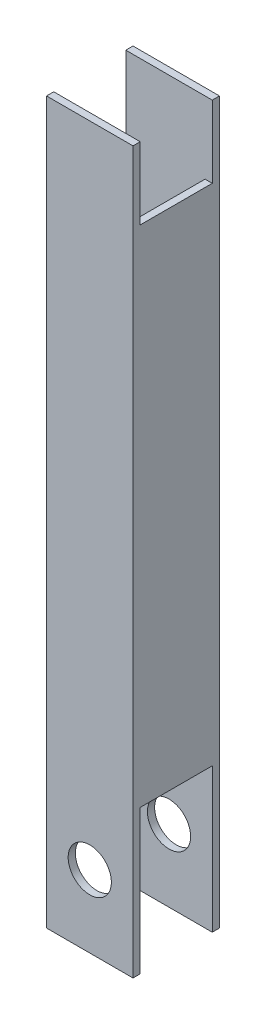
ISO-10303-21;
HEADER;
FILE_DESCRIPTION(('STEP AP214'),'2;1');
FILE_NAME('part.step','',(''),(''),'','','');
FILE_SCHEMA(('AUTOMOTIVE_DESIGN { 1 0 10303 214 1 1 1 1 }'));
ENDSEC;
DATA;
#1=APPLICATION_CONTEXT('core data for automotive mechanical design processes');
#2=APPLICATION_PROTOCOL_DEFINITION('international standard','automotive_design',2000,#1);
#3=PRODUCT_CONTEXT('',#1,'mechanical');
#4=PRODUCT('Part','Part','',(#3));
#5=PRODUCT_RELATED_PRODUCT_CATEGORY('part','',(#4));
#6=PRODUCT_DEFINITION_FORMATION('','',#4);
#7=PRODUCT_DEFINITION_CONTEXT('part definition',#1,'design');
#8=PRODUCT_DEFINITION('design','',#6,#7);
#9=PRODUCT_DEFINITION_SHAPE('','',#8);
#10=(LENGTH_UNIT() NAMED_UNIT(*) SI_UNIT(.MILLI.,.METRE.));
#11=(NAMED_UNIT(*) PLANE_ANGLE_UNIT() SI_UNIT($,.RADIAN.));
#12=(NAMED_UNIT(*) SI_UNIT($,.STERADIAN.) SOLID_ANGLE_UNIT());
#13=UNCERTAINTY_MEASURE_WITH_UNIT(LENGTH_MEASURE(1.E-05),#10,'distance_accuracy_value','');
#14=(GEOMETRIC_REPRESENTATION_CONTEXT(3) GLOBAL_UNCERTAINTY_ASSIGNED_CONTEXT((#13)) GLOBAL_UNIT_ASSIGNED_CONTEXT((#10,
#11,#12)) REPRESENTATION_CONTEXT('',''));
#15=CARTESIAN_POINT('',(0.,0.,0.));
#16=DIRECTION('',(0.,0.,1.));
#17=DIRECTION('',(1.,0.,0.));
#18=AXIS2_PLACEMENT_3D('',#15,#16,#17);
#19=CARTESIAN_POINT('',(0.,500.,0.));
#20=DIRECTION('',(0.,1.,0.));
#21=DIRECTION('',(0.,0.,1.));
#22=AXIS2_PLACEMENT_3D('',#19,#20,#21);
#23=PLANE('',#22);
#24=DIRECTION('',(1.,0.,0.));
#25=VECTOR('',#24,1.);
#26=CARTESIAN_POINT('',(30.,500.,25.));
#27=LINE('',#26,#25);
#28=CARTESIAN_POINT('',(-30.,500.,25.));
#29=VERTEX_POINT('',#28);
#30=CARTESIAN_POINT('',(30.,500.,25.));
#31=VERTEX_POINT('',#30);
#32=EDGE_CURVE('E170',#29,#31,#27,.T.);
#33=ORIENTED_EDGE('',*,*,#32,.F.);
#34=DIRECTION('',(0.,0.,1.));
#35=VECTOR('',#34,1.);
#36=CARTESIAN_POINT('',(-30.,500.,30.));
#37=LINE('',#36,#35);
#38=CARTESIAN_POINT('',(-30.,500.,30.));
#39=VERTEX_POINT('',#38);
#40=EDGE_CURVE('E201',#29,#39,#37,.T.);
#41=ORIENTED_EDGE('',*,*,#40,.T.);
#42=DIRECTION('',(1.,0.,0.));
#43=VECTOR('',#42,1.);
#44=CARTESIAN_POINT('',(30.,500.,30.));
#45=LINE('',#44,#43);
#46=CARTESIAN_POINT('',(30.,500.,30.));
#47=VERTEX_POINT('',#46);
#48=EDGE_CURVE('E288',#39,#47,#45,.T.);
#49=ORIENTED_EDGE('',*,*,#48,.T.);
#50=DIRECTION('',(0.,0.,-1.));
#51=VECTOR('',#50,1.);
#52=CARTESIAN_POINT('',(30.,500.,30.));
#53=LINE('',#52,#51);
#54=EDGE_CURVE('E215',#47,#31,#53,.T.);
#55=ORIENTED_EDGE('',*,*,#54,.T.);
#56=EDGE_LOOP('',(#33,#41,#49,#55));
#57=FACE_BOUND('',#56,.T.);
#58=ADVANCED_FACE('F47',(#57),#23,.T.);
#59=CARTESIAN_POINT('',(0.,0.,0.));
#60=DIRECTION('',(0.,1.,0.));
#61=DIRECTION('',(0.,0.,1.));
#62=AXIS2_PLACEMENT_3D('',#59,#60,#61);
#63=PLANE('',#62);
#64=DIRECTION('',(0.,0.,1.));
#65=VECTOR('',#64,1.);
#66=CARTESIAN_POINT('',(-30.,0.,30.));
#67=LINE('',#66,#65);
#68=CARTESIAN_POINT('',(-30.,0.,25.));
#69=VERTEX_POINT('',#68);
#70=CARTESIAN_POINT('',(-30.,0.,30.));
#71=VERTEX_POINT('',#70);
#72=EDGE_CURVE('E188',#69,#71,#67,.T.);
#73=ORIENTED_EDGE('',*,*,#72,.F.);
#74=DIRECTION('',(1.,0.,0.));
#75=VECTOR('',#74,1.);
#76=CARTESIAN_POINT('',(30.,0.,25.));
#77=LINE('',#76,#75);
#78=CARTESIAN_POINT('',(30.,0.,25.));
#79=VERTEX_POINT('',#78);
#80=EDGE_CURVE('E171',#69,#79,#77,.T.);
#81=ORIENTED_EDGE('',*,*,#80,.T.);
#82=DIRECTION('',(0.,0.,-1.));
#83=VECTOR('',#82,1.);
#84=CARTESIAN_POINT('',(30.,0.,30.));
#85=LINE('',#84,#83);
#86=CARTESIAN_POINT('',(30.,0.,30.));
#87=VERTEX_POINT('',#86);
#88=EDGE_CURVE('E196',#87,#79,#85,.T.);
#89=ORIENTED_EDGE('',*,*,#88,.F.);
#90=DIRECTION('',(1.,0.,0.));
#91=VECTOR('',#90,1.);
#92=CARTESIAN_POINT('',(30.,0.,30.));
#93=LINE('',#92,#91);
#94=EDGE_CURVE('E187',#71,#87,#93,.T.);
#95=ORIENTED_EDGE('',*,*,#94,.F.);
#96=EDGE_LOOP('',(#73,#81,#89,#95));
#97=FACE_BOUND('',#96,.T.);
#98=ADVANCED_FACE('F221',(#97),#63,.F.);
#99=CARTESIAN_POINT('',(-30.,500.,30.));
#100=DIRECTION('',(1.,0.,0.));
#101=DIRECTION('',(0.,0.,-1.));
#102=AXIS2_PLACEMENT_3D('',#99,#100,#101);
#103=PLANE('',#102);
#104=DIRECTION('',(0.,0.,1.));
#105=VECTOR('',#104,1.);
#106=CARTESIAN_POINT('',(-30.,100.,25.));
#107=LINE('',#106,#105);
#108=CARTESIAN_POINT('',(-30.,100.,-25.));
#109=VERTEX_POINT('',#108);
#110=CARTESIAN_POINT('',(-30.,100.,25.));
#111=VERTEX_POINT('',#110);
#112=EDGE_CURVE('E180',#109,#111,#107,.T.);
#113=ORIENTED_EDGE('',*,*,#112,.T.);
#114=DIRECTION('',(0.,-1.,0.));
#115=VECTOR('',#114,1.);
#116=CARTESIAN_POINT('',(-30.,0.,25.));
#117=LINE('',#116,#115);
#118=EDGE_CURVE('E311',#111,#69,#117,.T.);
#119=ORIENTED_EDGE('',*,*,#118,.T.);
#120=ORIENTED_EDGE('',*,*,#72,.T.);
#121=DIRECTION('',(0.,-1.,0.));
#122=VECTOR('',#121,1.);
#123=CARTESIAN_POINT('',(-30.,500.,30.));
#124=LINE('',#123,#122);
#125=EDGE_CURVE('E11',#39,#71,#124,.T.);
#126=ORIENTED_EDGE('',*,*,#125,.F.);
#127=ORIENTED_EDGE('',*,*,#40,.F.);
#128=DIRECTION('',(0.,-1.,0.));
#129=VECTOR('',#128,1.);
#130=CARTESIAN_POINT('',(-30.,450.,25.));
#131=LINE('',#130,#129);
#132=CARTESIAN_POINT('',(-30.,450.,25.));
#133=VERTEX_POINT('',#132);
#134=EDGE_CURVE('E245',#29,#133,#131,.T.);
#135=ORIENTED_EDGE('',*,*,#134,.T.);
#136=DIRECTION('',(0.,0.,-1.));
#137=VECTOR('',#136,1.);
#138=CARTESIAN_POINT('',(-30.,450.,25.));
#139=LINE('',#138,#137);
#140=CARTESIAN_POINT('',(-30.,450.,-25.));
#141=VERTEX_POINT('',#140);
#142=EDGE_CURVE('E254',#133,#141,#139,.T.);
#143=ORIENTED_EDGE('',*,*,#142,.T.);
#144=DIRECTION('',(0.,1.,0.));
#145=VECTOR('',#144,1.);
#146=CARTESIAN_POINT('',(-30.,450.,-25.));
#147=LINE('',#146,#145);
#148=CARTESIAN_POINT('',(-30.,500.,-25.));
#149=VERTEX_POINT('',#148);
#150=EDGE_CURVE('E262',#141,#149,#147,.T.);
#151=ORIENTED_EDGE('',*,*,#150,.T.);
#152=CARTESIAN_POINT('',(-30.,500.,-30.));
#153=VERTEX_POINT('',#152);
#154=EDGE_CURVE('E285',#153,#149,#37,.T.);
#155=ORIENTED_EDGE('',*,*,#154,.F.);
#156=DIRECTION('',(0.,-1.,0.));
#157=VECTOR('',#156,1.);
#158=CARTESIAN_POINT('',(-30.,500.,-30.));
#159=LINE('',#158,#157);
#160=CARTESIAN_POINT('',(-30.,0.,-30.));
#161=VERTEX_POINT('',#160);
#162=EDGE_CURVE('E186',#153,#161,#159,.T.);
#163=ORIENTED_EDGE('',*,*,#162,.T.);
#164=CARTESIAN_POINT('',(-30.,0.,-25.));
#165=VERTEX_POINT('',#164);
#166=EDGE_CURVE('E167',#161,#165,#67,.T.);
#167=ORIENTED_EDGE('',*,*,#166,.T.);
#168=DIRECTION('',(0.,1.,0.));
#169=VECTOR('',#168,1.);
#170=CARTESIAN_POINT('',(-30.,0.,-25.));
#171=LINE('',#170,#169);
#172=EDGE_CURVE('E174',#165,#109,#171,.T.);
#173=ORIENTED_EDGE('',*,*,#172,.T.);
#174=EDGE_LOOP('',(#113,#119,#120,#126,#127,#135,#143,#151,#155,#163,#167,#173));
#175=FACE_BOUND('',#174,.T.);
#176=ADVANCED_FACE('F49',(#175),#103,.F.);
#177=CARTESIAN_POINT('',(30.,500.,30.));
#178=DIRECTION('',(0.,0.,-1.));
#179=DIRECTION('',(-1.,0.,0.));
#180=AXIS2_PLACEMENT_3D('',#177,#178,#179);
#181=PLANE('',#180);
#182=CARTESIAN_POINT('',(0.,50.,30.));
#183=DIRECTION('',(0.,0.,-1.));
#184=DIRECTION('',(-1.,0.,0.));
#185=AXIS2_PLACEMENT_3D('',#182,#183,#184);
#186=CIRCLE('',#185,15.);
#187=CARTESIAN_POINT('',(-15.,50.,30.));
#188=VERTEX_POINT('',#187);
#189=EDGE_CURVE('E353',#188,#188,#186,.T.);
#190=ORIENTED_EDGE('',*,*,#189,.T.);
#191=EDGE_LOOP('',(#190));
#192=FACE_BOUND('',#191,.T.);
#193=ORIENTED_EDGE('',*,*,#94,.T.);
#194=DIRECTION('',(0.,-1.,0.));
#195=VECTOR('',#194,1.);
#196=CARTESIAN_POINT('',(30.,500.,30.));
#197=LINE('',#196,#195);
#198=EDGE_CURVE('E56',#47,#87,#197,.T.);
#199=ORIENTED_EDGE('',*,*,#198,.F.);
#200=ORIENTED_EDGE('',*,*,#48,.F.);
#201=ORIENTED_EDGE('',*,*,#125,.T.);
#202=EDGE_LOOP('',(#193,#199,#200,#201));
#203=FACE_BOUND('',#202,.T.);
#204=ADVANCED_FACE('F310',(#192,#203),#181,.F.);
#205=CARTESIAN_POINT('',(30.,500.,30.));
#206=DIRECTION('',(-1.,0.,0.));
#207=DIRECTION('',(0.,0.,1.));
#208=AXIS2_PLACEMENT_3D('',#205,#206,#207);
#209=PLANE('',#208);
#210=ORIENTED_EDGE('',*,*,#88,.T.);
#211=DIRECTION('',(0.,-1.,0.));
#212=VECTOR('',#211,1.);
#213=CARTESIAN_POINT('',(30.,0.,25.));
#214=LINE('',#213,#212);
#215=CARTESIAN_POINT('',(30.,100.,25.));
#216=VERTEX_POINT('',#215);
#217=EDGE_CURVE('E181',#216,#79,#214,.T.);
#218=ORIENTED_EDGE('',*,*,#217,.F.);
#219=DIRECTION('',(0.,0.,1.));
#220=VECTOR('',#219,1.);
#221=CARTESIAN_POINT('',(30.,100.,25.));
#222=LINE('',#221,#220);
#223=CARTESIAN_POINT('',(30.,100.,-25.));
#224=VERTEX_POINT('',#223);
#225=EDGE_CURVE('E233',#224,#216,#222,.T.);
#226=ORIENTED_EDGE('',*,*,#225,.F.);
#227=DIRECTION('',(0.,1.,0.));
#228=VECTOR('',#227,1.);
#229=CARTESIAN_POINT('',(30.,0.,-25.));
#230=LINE('',#229,#228);
#231=CARTESIAN_POINT('',(30.,0.,-25.));
#232=VERTEX_POINT('',#231);
#233=EDGE_CURVE('E235',#232,#224,#230,.T.);
#234=ORIENTED_EDGE('',*,*,#233,.F.);
#235=CARTESIAN_POINT('',(30.,0.,-30.));
#236=VERTEX_POINT('',#235);
#237=EDGE_CURVE('E168',#232,#236,#85,.T.);
#238=ORIENTED_EDGE('',*,*,#237,.T.);
#239=DIRECTION('',(0.,-1.,0.));
#240=VECTOR('',#239,1.);
#241=CARTESIAN_POINT('',(30.,500.,-30.));
#242=LINE('',#241,#240);
#243=CARTESIAN_POINT('',(30.,500.,-30.));
#244=VERTEX_POINT('',#243);
#245=EDGE_CURVE('E203',#244,#236,#242,.T.);
#246=ORIENTED_EDGE('',*,*,#245,.F.);
#247=CARTESIAN_POINT('',(30.,500.,-25.));
#248=VERTEX_POINT('',#247);
#249=EDGE_CURVE('E289',#248,#244,#53,.T.);
#250=ORIENTED_EDGE('',*,*,#249,.F.);
#251=DIRECTION('',(0.,1.,0.));
#252=VECTOR('',#251,1.);
#253=CARTESIAN_POINT('',(30.,450.,-25.));
#254=LINE('',#253,#252);
#255=CARTESIAN_POINT('',(30.,450.,-25.));
#256=VERTEX_POINT('',#255);
#257=EDGE_CURVE('E253',#256,#248,#254,.T.);
#258=ORIENTED_EDGE('',*,*,#257,.F.);
#259=DIRECTION('',(0.,0.,-1.));
#260=VECTOR('',#259,1.);
#261=CARTESIAN_POINT('',(30.,450.,25.));
#262=LINE('',#261,#260);
#263=CARTESIAN_POINT('',(30.,450.,25.));
#264=VERTEX_POINT('',#263);
#265=EDGE_CURVE('E257',#264,#256,#262,.T.);
#266=ORIENTED_EDGE('',*,*,#265,.F.);
#267=DIRECTION('',(0.,-1.,0.));
#268=VECTOR('',#267,1.);
#269=CARTESIAN_POINT('',(30.,450.,25.));
#270=LINE('',#269,#268);
#271=EDGE_CURVE('E250',#31,#264,#270,.T.);
#272=ORIENTED_EDGE('',*,*,#271,.F.);
#273=ORIENTED_EDGE('',*,*,#54,.F.);
#274=ORIENTED_EDGE('',*,*,#198,.T.);
#275=EDGE_LOOP('',(#210,#218,#226,#234,#238,#246,#250,#258,#266,#272,#273,#274));
#276=FACE_BOUND('',#275,.T.);
#277=ADVANCED_FACE('F211',(#276),#209,.F.);
#278=CARTESIAN_POINT('',(30.,500.,-30.));
#279=DIRECTION('',(0.,0.,1.));
#280=DIRECTION('',(1.,0.,0.));
#281=AXIS2_PLACEMENT_3D('',#278,#279,#280);
#282=PLANE('',#281);
#283=CARTESIAN_POINT('',(0.,50.,-30.));
#284=DIRECTION('',(0.,0.,-1.));
#285=DIRECTION('',(-1.,0.,0.));
#286=AXIS2_PLACEMENT_3D('',#283,#284,#285);
#287=CIRCLE('',#286,15.);
#288=CARTESIAN_POINT('',(-15.,50.,-30.));
#289=VERTEX_POINT('',#288);
#290=EDGE_CURVE('E355',#289,#289,#287,.T.);
#291=ORIENTED_EDGE('',*,*,#290,.F.);
#292=EDGE_LOOP('',(#291));
#293=FACE_BOUND('',#292,.T.);
#294=DIRECTION('',(-1.,0.,0.));
#295=VECTOR('',#294,1.);
#296=CARTESIAN_POINT('',(30.,0.,-30.));
#297=LINE('',#296,#295);
#298=EDGE_CURVE('E199',#236,#161,#297,.T.);
#299=ORIENTED_EDGE('',*,*,#298,.T.);
#300=ORIENTED_EDGE('',*,*,#162,.F.);
#301=DIRECTION('',(-1.,0.,0.));
#302=VECTOR('',#301,1.);
#303=CARTESIAN_POINT('',(30.,500.,-30.));
#304=LINE('',#303,#302);
#305=EDGE_CURVE('E193',#244,#153,#304,.T.);
#306=ORIENTED_EDGE('',*,*,#305,.F.);
#307=ORIENTED_EDGE('',*,*,#245,.T.);
#308=EDGE_LOOP('',(#299,#300,#306,#307));
#309=FACE_BOUND('',#308,.T.);
#310=ADVANCED_FACE('F298',(#293,#309),#282,.F.);
#311=DIRECTION('',(-1.,0.,0.));
#312=VECTOR('',#311,1.);
#313=CARTESIAN_POINT('',(30.,500.,-25.));
#314=LINE('',#313,#312);
#315=EDGE_CURVE('E279',#248,#149,#314,.T.);
#316=ORIENTED_EDGE('',*,*,#315,.F.);
#317=ORIENTED_EDGE('',*,*,#249,.T.);
#318=ORIENTED_EDGE('',*,*,#305,.T.);
#319=ORIENTED_EDGE('',*,*,#154,.T.);
#320=EDGE_LOOP('',(#316,#317,#318,#319));
#321=FACE_BOUND('',#320,.T.);
#322=ADVANCED_FACE('F294',(#321),#23,.T.);
#323=ORIENTED_EDGE('',*,*,#237,.F.);
#324=DIRECTION('',(-1.,0.,0.));
#325=VECTOR('',#324,1.);
#326=CARTESIAN_POINT('',(30.,0.,-25.));
#327=LINE('',#326,#325);
#328=EDGE_CURVE('E162',#232,#165,#327,.T.);
#329=ORIENTED_EDGE('',*,*,#328,.T.);
#330=ORIENTED_EDGE('',*,*,#166,.F.);
#331=ORIENTED_EDGE('',*,*,#298,.F.);
#332=EDGE_LOOP('',(#323,#329,#330,#331));
#333=FACE_BOUND('',#332,.T.);
#334=ADVANCED_FACE('F164',(#333),#63,.F.);
#335=CARTESIAN_POINT('',(-25.,500.,30.));
#336=DIRECTION('',(1.,0.,0.));
#337=DIRECTION('',(0.,0.,-1.));
#338=AXIS2_PLACEMENT_3D('',#335,#336,#337);
#339=PLANE('',#338);
#340=DIRECTION('',(0.,0.,1.));
#341=VECTOR('',#340,1.);
#342=CARTESIAN_POINT('',(-25.,100.,30.));
#343=LINE('',#342,#341);
#344=CARTESIAN_POINT('',(-25.,100.,-25.));
#345=VERTEX_POINT('',#344);
#346=CARTESIAN_POINT('',(-25.,100.,25.));
#347=VERTEX_POINT('',#346);
#348=EDGE_CURVE('E226',#345,#347,#343,.T.);
#349=ORIENTED_EDGE('',*,*,#348,.F.);
#350=DIRECTION('',(0.,-1.,0.));
#351=VECTOR('',#350,1.);
#352=CARTESIAN_POINT('',(-25.,500.,-25.));
#353=LINE('',#352,#351);
#354=CARTESIAN_POINT('',(-25.,450.,-25.));
#355=VERTEX_POINT('',#354);
#356=EDGE_CURVE('E276',#355,#345,#353,.T.);
#357=ORIENTED_EDGE('',*,*,#356,.F.);
#358=DIRECTION('',(0.,0.,-1.));
#359=VECTOR('',#358,1.);
#360=CARTESIAN_POINT('',(-25.,450.,30.));
#361=LINE('',#360,#359);
#362=CARTESIAN_POINT('',(-25.,450.,25.));
#363=VERTEX_POINT('',#362);
#364=EDGE_CURVE('E268',#363,#355,#361,.T.);
#365=ORIENTED_EDGE('',*,*,#364,.F.);
#366=DIRECTION('',(0.,-1.,0.));
#367=VECTOR('',#366,1.);
#368=CARTESIAN_POINT('',(-25.,500.,25.));
#369=LINE('',#368,#367);
#370=EDGE_CURVE('E191',#363,#347,#369,.T.);
#371=ORIENTED_EDGE('',*,*,#370,.T.);
#372=EDGE_LOOP('',(#349,#357,#365,#371));
#373=FACE_BOUND('',#372,.T.);
#374=ADVANCED_FACE('F329',(#373),#339,.T.);
#375=CARTESIAN_POINT('',(30.,500.,25.));
#376=DIRECTION('',(0.,0.,-1.));
#377=DIRECTION('',(-1.,0.,0.));
#378=AXIS2_PLACEMENT_3D('',#375,#376,#377);
#379=PLANE('',#378);
#380=CARTESIAN_POINT('',(0.,50.,25.));
#381=DIRECTION('',(0.,0.,-1.));
#382=DIRECTION('',(-1.,0.,0.));
#383=AXIS2_PLACEMENT_3D('',#380,#381,#382);
#384=CIRCLE('',#383,15.);
#385=CARTESIAN_POINT('',(-15.,50.,25.));
#386=VERTEX_POINT('',#385);
#387=EDGE_CURVE('E306',#386,#386,#384,.T.);
#388=ORIENTED_EDGE('',*,*,#387,.F.);
#389=EDGE_LOOP('',(#388));
#390=FACE_BOUND('',#389,.T.);
#391=DIRECTION('',(0.,-1.,0.));
#392=VECTOR('',#391,1.);
#393=CARTESIAN_POINT('',(25.,500.,25.));
#394=LINE('',#393,#392);
#395=CARTESIAN_POINT('',(25.,450.,25.));
#396=VERTEX_POINT('',#395);
#397=CARTESIAN_POINT('',(25.,100.,25.));
#398=VERTEX_POINT('',#397);
#399=EDGE_CURVE('E275',#396,#398,#394,.T.);
#400=ORIENTED_EDGE('',*,*,#399,.T.);
#401=DIRECTION('',(1.,0.,0.));
#402=VECTOR('',#401,1.);
#403=CARTESIAN_POINT('',(-30.,100.,25.));
#404=LINE('',#403,#402);
#405=EDGE_CURVE('E230',#398,#216,#404,.T.);
#406=ORIENTED_EDGE('',*,*,#405,.T.);
#407=ORIENTED_EDGE('',*,*,#217,.T.);
#408=ORIENTED_EDGE('',*,*,#80,.F.);
#409=ORIENTED_EDGE('',*,*,#118,.F.);
#410=EDGE_CURVE('E239',#111,#347,#404,.T.);
#411=ORIENTED_EDGE('',*,*,#410,.T.);
#412=ORIENTED_EDGE('',*,*,#370,.F.);
#413=DIRECTION('',(1.,0.,0.));
#414=VECTOR('',#413,1.);
#415=CARTESIAN_POINT('',(-30.,450.,25.));
#416=LINE('',#415,#414);
#417=EDGE_CURVE('E247',#133,#363,#416,.T.);
#418=ORIENTED_EDGE('',*,*,#417,.F.);
#419=ORIENTED_EDGE('',*,*,#134,.F.);
#420=ORIENTED_EDGE('',*,*,#32,.T.);
#421=ORIENTED_EDGE('',*,*,#271,.T.);
#422=EDGE_CURVE('E249',#396,#264,#416,.T.);
#423=ORIENTED_EDGE('',*,*,#422,.F.);
#424=EDGE_LOOP('',(#400,#406,#407,#408,#409,#411,#412,#418,#419,#420,#421,#423));
#425=FACE_BOUND('',#424,.T.);
#426=ADVANCED_FACE('F229',(#390,#425),#379,.T.);
#427=CARTESIAN_POINT('',(25.,500.,30.));
#428=DIRECTION('',(-1.,0.,0.));
#429=DIRECTION('',(0.,0.,1.));
#430=AXIS2_PLACEMENT_3D('',#427,#428,#429);
#431=PLANE('',#430);
#432=DIRECTION('',(0.,0.,-1.));
#433=VECTOR('',#432,1.);
#434=CARTESIAN_POINT('',(25.,100.,30.));
#435=LINE('',#434,#433);
#436=CARTESIAN_POINT('',(25.,100.,-25.));
#437=VERTEX_POINT('',#436);
#438=EDGE_CURVE('E270',#398,#437,#435,.T.);
#439=ORIENTED_EDGE('',*,*,#438,.F.);
#440=ORIENTED_EDGE('',*,*,#399,.F.);
#441=DIRECTION('',(0.,0.,1.));
#442=VECTOR('',#441,1.);
#443=CARTESIAN_POINT('',(25.,450.,30.));
#444=LINE('',#443,#442);
#445=CARTESIAN_POINT('',(25.,450.,-25.));
#446=VERTEX_POINT('',#445);
#447=EDGE_CURVE('E242',#446,#396,#444,.T.);
#448=ORIENTED_EDGE('',*,*,#447,.F.);
#449=DIRECTION('',(0.,-1.,0.));
#450=VECTOR('',#449,1.);
#451=CARTESIAN_POINT('',(25.,500.,-25.));
#452=LINE('',#451,#450);
#453=EDGE_CURVE('E278',#446,#437,#452,.T.);
#454=ORIENTED_EDGE('',*,*,#453,.T.);
#455=EDGE_LOOP('',(#439,#440,#448,#454));
#456=FACE_BOUND('',#455,.T.);
#457=ADVANCED_FACE('F318',(#456),#431,.T.);
#458=CARTESIAN_POINT('',(30.,500.,-25.));
#459=DIRECTION('',(0.,0.,1.));
#460=DIRECTION('',(1.,0.,0.));
#461=AXIS2_PLACEMENT_3D('',#458,#459,#460);
#462=PLANE('',#461);
#463=CARTESIAN_POINT('',(0.,50.,-25.));
#464=DIRECTION('',(0.,0.,1.));
#465=DIRECTION('',(1.,0.,0.));
#466=AXIS2_PLACEMENT_3D('',#463,#464,#465);
#467=CIRCLE('',#466,15.);
#468=CARTESIAN_POINT('',(15.,50.,-25.));
#469=VERTEX_POINT('',#468);
#470=EDGE_CURVE('E51',#469,#469,#467,.T.);
#471=ORIENTED_EDGE('',*,*,#470,.F.);
#472=EDGE_LOOP('',(#471));
#473=FACE_BOUND('',#472,.T.);
#474=ORIENTED_EDGE('',*,*,#356,.T.);
#475=DIRECTION('',(1.,0.,0.));
#476=VECTOR('',#475,1.);
#477=CARTESIAN_POINT('',(-30.,100.,-25.));
#478=LINE('',#477,#476);
#479=EDGE_CURVE('E176',#109,#345,#478,.T.);
#480=ORIENTED_EDGE('',*,*,#479,.F.);
#481=ORIENTED_EDGE('',*,*,#172,.F.);
#482=ORIENTED_EDGE('',*,*,#328,.F.);
#483=ORIENTED_EDGE('',*,*,#233,.T.);
#484=EDGE_CURVE('E70',#437,#224,#478,.T.);
#485=ORIENTED_EDGE('',*,*,#484,.F.);
#486=ORIENTED_EDGE('',*,*,#453,.F.);
#487=DIRECTION('',(1.,0.,0.));
#488=VECTOR('',#487,1.);
#489=CARTESIAN_POINT('',(-30.,450.,-25.));
#490=LINE('',#489,#488);
#491=EDGE_CURVE('E246',#446,#256,#490,.T.);
#492=ORIENTED_EDGE('',*,*,#491,.T.);
#493=ORIENTED_EDGE('',*,*,#257,.T.);
#494=ORIENTED_EDGE('',*,*,#315,.T.);
#495=ORIENTED_EDGE('',*,*,#150,.F.);
#496=EDGE_CURVE('E63',#141,#355,#490,.T.);
#497=ORIENTED_EDGE('',*,*,#496,.T.);
#498=EDGE_LOOP('',(#474,#480,#481,#482,#483,#485,#486,#492,#493,#494,#495,#497));
#499=FACE_BOUND('',#498,.T.);
#500=ADVANCED_FACE('F175',(#473,#499),#462,.T.);
#501=CARTESIAN_POINT('',(-30.,450.,25.));
#502=DIRECTION('',(0.,-1.,0.));
#503=DIRECTION('',(0.,0.,-1.));
#504=AXIS2_PLACEMENT_3D('',#501,#502,#503);
#505=PLANE('',#504);
#506=ORIENTED_EDGE('',*,*,#447,.T.);
#507=ORIENTED_EDGE('',*,*,#422,.T.);
#508=ORIENTED_EDGE('',*,*,#265,.T.);
#509=ORIENTED_EDGE('',*,*,#491,.F.);
#510=EDGE_LOOP('',(#506,#507,#508,#509));
#511=FACE_BOUND('',#510,.T.);
#512=ADVANCED_FACE('F302',(#511),#505,.F.);
#513=CARTESIAN_POINT('',(-30.,100.,25.));
#514=DIRECTION('',(0.,1.,0.));
#515=DIRECTION('',(0.,0.,1.));
#516=AXIS2_PLACEMENT_3D('',#513,#514,#515);
#517=PLANE('',#516);
#518=ORIENTED_EDGE('',*,*,#438,.T.);
#519=ORIENTED_EDGE('',*,*,#484,.T.);
#520=ORIENTED_EDGE('',*,*,#225,.T.);
#521=ORIENTED_EDGE('',*,*,#405,.F.);
#522=EDGE_LOOP('',(#518,#519,#520,#521));
#523=FACE_BOUND('',#522,.T.);
#524=ADVANCED_FACE('F315',(#523),#517,.F.);
#525=ORIENTED_EDGE('',*,*,#364,.T.);
#526=ORIENTED_EDGE('',*,*,#496,.F.);
#527=ORIENTED_EDGE('',*,*,#142,.F.);
#528=ORIENTED_EDGE('',*,*,#417,.T.);
#529=EDGE_LOOP('',(#525,#526,#527,#528));
#530=FACE_BOUND('',#529,.T.);
#531=ADVANCED_FACE('F376',(#530),#505,.F.);
#532=ORIENTED_EDGE('',*,*,#348,.T.);
#533=ORIENTED_EDGE('',*,*,#410,.F.);
#534=ORIENTED_EDGE('',*,*,#112,.F.);
#535=ORIENTED_EDGE('',*,*,#479,.T.);
#536=EDGE_LOOP('',(#532,#533,#534,#535));
#537=FACE_BOUND('',#536,.T.);
#538=ADVANCED_FACE('F371',(#537),#517,.F.);
#539=CARTESIAN_POINT('',(0.,50.,30.));
#540=DIRECTION('',(0.,0.,-1.));
#541=DIRECTION('',(-1.,0.,0.));
#542=AXIS2_PLACEMENT_3D('',#539,#540,#541);
#543=CYLINDRICAL_SURFACE('',#542,15.);
#544=ORIENTED_EDGE('',*,*,#470,.T.);
#545=EDGE_LOOP('',(#544));
#546=FACE_BOUND('',#545,.T.);
#547=ORIENTED_EDGE('',*,*,#290,.T.);
#548=EDGE_LOOP('',(#547));
#549=FACE_BOUND('',#548,.T.);
#550=ADVANCED_FACE('F366',(#546,#549),#543,.F.);
#551=ORIENTED_EDGE('',*,*,#387,.T.);
#552=EDGE_LOOP('',(#551));
#553=FACE_BOUND('',#552,.T.);
#554=ORIENTED_EDGE('',*,*,#189,.F.);
#555=EDGE_LOOP('',(#554));
#556=FACE_BOUND('',#555,.T.);
#557=ADVANCED_FACE('F364',(#553,#556),#543,.F.);
#558=CLOSED_SHELL('',(#58,#98,#176,#204,#277,#310,#322,#334,#374,#426,#457,#500,#512,#524,#531,
#538,#550,#557));
#559=MANIFOLD_SOLID_BREP('B2',#558);
#560=ADVANCED_BREP_SHAPE_REPRESENTATION('',(#18,#559),#14);
#561=SHAPE_DEFINITION_REPRESENTATION(#9,#560);
ENDSEC;
END-ISO-10303-21;
